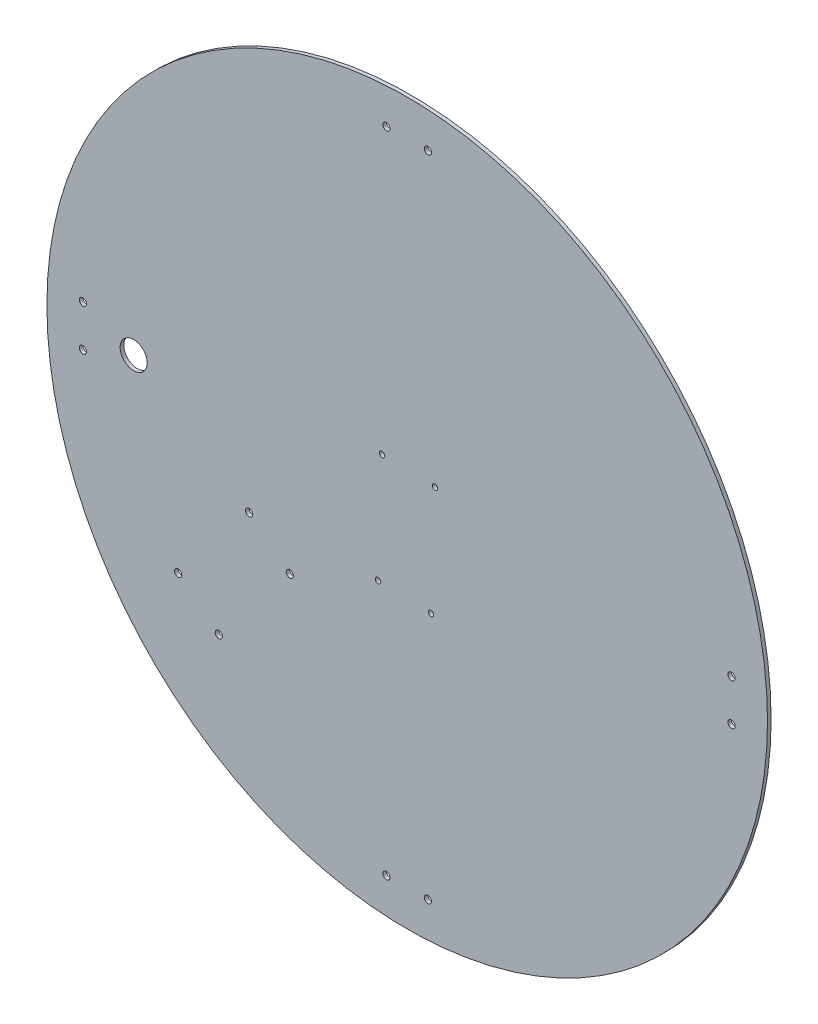
ISO-10303-21;
HEADER;
FILE_DESCRIPTION(('STEP AP214'),'2;1');
FILE_NAME('part.step','',(''),(''),'','','');
FILE_SCHEMA(('AUTOMOTIVE_DESIGN { 1 0 10303 214 1 1 1 1 }'));
ENDSEC;
DATA;
#1=APPLICATION_CONTEXT('core data for automotive mechanical design processes');
#2=APPLICATION_PROTOCOL_DEFINITION('international standard','automotive_design',2000,#1);
#3=PRODUCT_CONTEXT('',#1,'mechanical');
#4=PRODUCT('Part','Part','',(#3));
#5=PRODUCT_RELATED_PRODUCT_CATEGORY('part','',(#4));
#6=PRODUCT_DEFINITION_FORMATION('','',#4);
#7=PRODUCT_DEFINITION_CONTEXT('part definition',#1,'design');
#8=PRODUCT_DEFINITION('design','',#6,#7);
#9=PRODUCT_DEFINITION_SHAPE('','',#8);
#10=(LENGTH_UNIT() NAMED_UNIT(*) SI_UNIT(.MILLI.,.METRE.));
#11=(NAMED_UNIT(*) PLANE_ANGLE_UNIT() SI_UNIT($,.RADIAN.));
#12=(NAMED_UNIT(*) SI_UNIT($,.STERADIAN.) SOLID_ANGLE_UNIT());
#13=UNCERTAINTY_MEASURE_WITH_UNIT(LENGTH_MEASURE(1.E-05),#10,'distance_accuracy_value','');
#14=(GEOMETRIC_REPRESENTATION_CONTEXT(3) GLOBAL_UNCERTAINTY_ASSIGNED_CONTEXT((#13)) GLOBAL_UNIT_ASSIGNED_CONTEXT((#10,
#11,#12)) REPRESENTATION_CONTEXT('',''));
#15=CARTESIAN_POINT('',(0.,0.,0.));
#16=DIRECTION('',(0.,0.,1.));
#17=DIRECTION('',(1.,0.,0.));
#18=AXIS2_PLACEMENT_3D('',#15,#16,#17);
#19=CARTESIAN_POINT('',(0.,0.,2.));
#20=DIRECTION('',(0.,0.,-1.));
#21=DIRECTION('',(-1.,0.,0.));
#22=AXIS2_PLACEMENT_3D('',#19,#20,#21);
#23=CYLINDRICAL_SURFACE('',#22,200.);
#24=CARTESIAN_POINT('',(0.,0.,2.));
#25=DIRECTION('',(0.,0.,1.));
#26=DIRECTION('',(1.,0.,0.));
#27=AXIS2_PLACEMENT_3D('',#24,#25,#26);
#28=CIRCLE('',#27,200.);
#29=CARTESIAN_POINT('',(200.,0.,2.));
#30=VERTEX_POINT('',#29);
#31=EDGE_CURVE('E12',#30,#30,#28,.T.);
#32=ORIENTED_EDGE('',*,*,#31,.F.);
#33=EDGE_LOOP('',(#32));
#34=FACE_BOUND('',#33,.T.);
#35=CARTESIAN_POINT('',(0.,0.,0.));
#36=DIRECTION('',(0.,0.,1.));
#37=DIRECTION('',(1.,0.,0.));
#38=AXIS2_PLACEMENT_3D('',#35,#36,#37);
#39=CIRCLE('',#38,200.);
#40=CARTESIAN_POINT('',(200.,0.,0.));
#41=VERTEX_POINT('',#40);
#42=EDGE_CURVE('E47',#41,#41,#39,.T.);
#43=ORIENTED_EDGE('',*,*,#42,.T.);
#44=EDGE_LOOP('',(#43));
#45=FACE_BOUND('',#44,.T.);
#46=ADVANCED_FACE('F44',(#34,#45),#23,.T.);
#47=CARTESIAN_POINT('',(0.,0.,2.));
#48=DIRECTION('',(0.,0.,1.));
#49=DIRECTION('',(1.,0.,0.));
#50=AXIS2_PLACEMENT_3D('',#47,#48,#49);
#51=PLANE('',#50);
#52=CARTESIAN_POINT('',(-13.9482140909751,21.2138474509534,2.));
#53=DIRECTION('',(0.,0.,1.));
#54=DIRECTION('',(1.,0.,0.));
#55=AXIS2_PLACEMENT_3D('',#52,#53,#54);
#56=CIRCLE('',#55,1.50000000000003);
#57=CARTESIAN_POINT('',(-12.4482140909751,21.2138474509534,2.));
#58=VERTEX_POINT('',#57);
#59=EDGE_CURVE('E126',#58,#58,#56,.T.);
#60=ORIENTED_EDGE('',*,*,#59,.F.);
#61=EDGE_LOOP('',(#60));
#62=FACE_BOUND('',#61,.T.);
#63=CARTESIAN_POINT('',(13.2166420172915,-41.6007256401468,2.));
#64=DIRECTION('',(0.,0.,1.));
#65=DIRECTION('',(1.,0.,0.));
#66=AXIS2_PLACEMENT_3D('',#63,#64,#65);
#67=CIRCLE('',#66,1.50000000000003);
#68=CARTESIAN_POINT('',(14.7166420172915,-41.6007256401468,2.));
#69=VERTEX_POINT('',#68);
#70=EDGE_CURVE('E136',#69,#69,#67,.T.);
#71=ORIENTED_EDGE('',*,*,#70,.F.);
#72=EDGE_LOOP('',(#71));
#73=FACE_BOUND('',#72,.T.);
#74=CARTESIAN_POINT('',(-16.1644471377225,-40.5464011810145,2.));
#75=DIRECTION('',(0.,0.,1.));
#76=DIRECTION('',(1.,0.,0.));
#77=AXIS2_PLACEMENT_3D('',#74,#75,#76);
#78=CIRCLE('',#77,1.50000000000003);
#79=CARTESIAN_POINT('',(-14.6644471377224,-40.5464011810145,2.));
#80=VERTEX_POINT('',#79);
#81=EDGE_CURVE('E139',#80,#80,#78,.T.);
#82=ORIENTED_EDGE('',*,*,#81,.F.);
#83=EDGE_LOOP('',(#82));
#84=FACE_BOUND('',#83,.T.);
#85=CARTESIAN_POINT('',(15.4328750640389,20.1595229918212,2.));
#86=DIRECTION('',(0.,0.,1.));
#87=DIRECTION('',(1.,0.,0.));
#88=AXIS2_PLACEMENT_3D('',#85,#86,#87);
#89=CIRCLE('',#88,1.50000000000002);
#90=CARTESIAN_POINT('',(16.9328750640389,20.1595229918212,2.));
#91=VERTEX_POINT('',#90);
#92=EDGE_CURVE('E142',#91,#91,#89,.T.);
#93=ORIENTED_EDGE('',*,*,#92,.F.);
#94=EDGE_LOOP('',(#93));
#95=FACE_BOUND('',#94,.T.);
#96=CARTESIAN_POINT('',(-127.130690153828,-92.4128741981416,2.));
#97=DIRECTION('',(0.,0.,1.));
#98=DIRECTION('',(1.,0.,0.));
#99=AXIS2_PLACEMENT_3D('',#96,#97,#98);
#100=CIRCLE('',#99,2.);
#101=CARTESIAN_POINT('',(-125.130690153828,-92.4128741981416,2.));
#102=VERTEX_POINT('',#101);
#103=EDGE_CURVE('E107',#102,#102,#100,.T.);
#104=ORIENTED_EDGE('',*,*,#103,.F.);
#105=EDGE_LOOP('',(#104));
#106=FACE_BOUND('',#105,.T.);
#107=CARTESIAN_POINT('',(-104.565936539044,-110.629127773014,2.));
#108=DIRECTION('',(0.,0.,1.));
#109=DIRECTION('',(1.,0.,0.));
#110=AXIS2_PLACEMENT_3D('',#107,#108,#109);
#111=CIRCLE('',#110,2.);
#112=CARTESIAN_POINT('',(-102.565936539044,-110.629127773014,2.));
#113=VERTEX_POINT('',#112);
#114=EDGE_CURVE('E112',#113,#113,#111,.T.);
#115=ORIENTED_EDGE('',*,*,#114,.F.);
#116=EDGE_LOOP('',(#115));
#117=FACE_BOUND('',#116,.T.);
#118=CARTESIAN_POINT('',(-65.1811400168184,-61.8425742679459,2.));
#119=DIRECTION('',(0.,0.,1.));
#120=DIRECTION('',(1.,0.,0.));
#121=AXIS2_PLACEMENT_3D('',#118,#119,#120);
#122=CIRCLE('',#121,2.);
#123=CARTESIAN_POINT('',(-63.1811400168184,-61.8425742679459,2.));
#124=VERTEX_POINT('',#123);
#125=EDGE_CURVE('E115',#124,#124,#122,.T.);
#126=ORIENTED_EDGE('',*,*,#125,.F.);
#127=EDGE_LOOP('',(#126));
#128=FACE_BOUND('',#127,.T.);
#129=CARTESIAN_POINT('',(-87.7458936316029,-43.626320693073,2.));
#130=DIRECTION('',(0.,0.,1.));
#131=DIRECTION('',(1.,0.,0.));
#132=AXIS2_PLACEMENT_3D('',#129,#130,#131);
#133=CIRCLE('',#132,2.);
#134=CARTESIAN_POINT('',(-85.7458936316029,-43.626320693073,2.));
#135=VERTEX_POINT('',#134);
#136=EDGE_CURVE('E118',#135,#135,#133,.T.);
#137=ORIENTED_EDGE('',*,*,#136,.F.);
#138=EDGE_LOOP('',(#137));
#139=FACE_BOUND('',#138,.T.);
#140=CARTESIAN_POINT('',(-151.829580254539,0.,2.));
#141=DIRECTION('',(0.,0.,-1.));
#142=DIRECTION('',(-1.,0.,0.));
#143=AXIS2_PLACEMENT_3D('',#140,#141,#142);
#144=CIRCLE('',#143,7.50000000000001);
#145=CARTESIAN_POINT('',(-159.329580254539,0.,2.));
#146=VERTEX_POINT('',#145);
#147=EDGE_CURVE('E103',#146,#146,#144,.T.);
#148=ORIENTED_EDGE('',*,*,#147,.T.);
#149=EDGE_LOOP('',(#148));
#150=FACE_BOUND('',#149,.T.);
#151=CARTESIAN_POINT('',(180.,11.5000000000019,2.));
#152=DIRECTION('',(0.,0.,1.));
#153=DIRECTION('',(1.,0.,0.));
#154=AXIS2_PLACEMENT_3D('',#151,#152,#153);
#155=CIRCLE('',#154,2.);
#156=CARTESIAN_POINT('',(182.,11.5000000000019,2.));
#157=VERTEX_POINT('',#156);
#158=EDGE_CURVE('E65',#157,#157,#155,.T.);
#159=ORIENTED_EDGE('',*,*,#158,.F.);
#160=EDGE_LOOP('',(#159));
#161=FACE_BOUND('',#160,.T.);
#162=CARTESIAN_POINT('',(-11.5,-180.,2.));
#163=DIRECTION('',(0.,0.,1.));
#164=DIRECTION('',(1.,0.,0.));
#165=AXIS2_PLACEMENT_3D('',#162,#163,#164);
#166=CIRCLE('',#165,2.);
#167=CARTESIAN_POINT('',(-9.5,-180.,2.));
#168=VERTEX_POINT('',#167);
#169=EDGE_CURVE('E70',#168,#168,#166,.T.);
#170=ORIENTED_EDGE('',*,*,#169,.F.);
#171=EDGE_LOOP('',(#170));
#172=FACE_BOUND('',#171,.T.);
#173=CARTESIAN_POINT('',(11.5,-180.,2.));
#174=DIRECTION('',(0.,0.,1.));
#175=DIRECTION('',(1.,0.,0.));
#176=AXIS2_PLACEMENT_3D('',#173,#174,#175);
#177=CIRCLE('',#176,2.);
#178=CARTESIAN_POINT('',(13.5,-180.,2.));
#179=VERTEX_POINT('',#178);
#180=EDGE_CURVE('E73',#179,#179,#177,.T.);
#181=ORIENTED_EDGE('',*,*,#180,.F.);
#182=EDGE_LOOP('',(#181));
#183=FACE_BOUND('',#182,.T.);
#184=CARTESIAN_POINT('',(-180.,11.4999999999994,2.));
#185=DIRECTION('',(0.,0.,1.));
#186=DIRECTION('',(1.,0.,0.));
#187=AXIS2_PLACEMENT_3D('',#184,#185,#186);
#188=CIRCLE('',#187,2.);
#189=CARTESIAN_POINT('',(-178.,11.4999999999994,2.));
#190=VERTEX_POINT('',#189);
#191=EDGE_CURVE('E76',#190,#190,#188,.T.);
#192=ORIENTED_EDGE('',*,*,#191,.F.);
#193=EDGE_LOOP('',(#192));
#194=FACE_BOUND('',#193,.T.);
#195=CARTESIAN_POINT('',(180.,-11.4999999999981,2.));
#196=DIRECTION('',(0.,0.,1.));
#197=DIRECTION('',(1.,0.,0.));
#198=AXIS2_PLACEMENT_3D('',#195,#196,#197);
#199=CIRCLE('',#198,2.);
#200=CARTESIAN_POINT('',(182.,-11.4999999999981,2.));
#201=VERTEX_POINT('',#200);
#202=EDGE_CURVE('E79',#201,#201,#199,.T.);
#203=ORIENTED_EDGE('',*,*,#202,.F.);
#204=EDGE_LOOP('',(#203));
#205=FACE_BOUND('',#204,.T.);
#206=CARTESIAN_POINT('',(-180.,-11.5000000000006,2.));
#207=DIRECTION('',(0.,0.,1.));
#208=DIRECTION('',(1.,0.,0.));
#209=AXIS2_PLACEMENT_3D('',#206,#207,#208);
#210=CIRCLE('',#209,2.);
#211=CARTESIAN_POINT('',(-178.,-11.5000000000006,2.));
#212=VERTEX_POINT('',#211);
#213=EDGE_CURVE('E82',#212,#212,#210,.T.);
#214=ORIENTED_EDGE('',*,*,#213,.F.);
#215=EDGE_LOOP('',(#214));
#216=FACE_BOUND('',#215,.T.);
#217=CARTESIAN_POINT('',(-11.5,180.,2.));
#218=DIRECTION('',(0.,0.,1.));
#219=DIRECTION('',(1.,0.,0.));
#220=AXIS2_PLACEMENT_3D('',#217,#218,#219);
#221=CIRCLE('',#220,2.);
#222=CARTESIAN_POINT('',(-9.5,180.,2.));
#223=VERTEX_POINT('',#222);
#224=EDGE_CURVE('E54',#223,#223,#221,.T.);
#225=ORIENTED_EDGE('',*,*,#224,.F.);
#226=EDGE_LOOP('',(#225));
#227=FACE_BOUND('',#226,.T.);
#228=CARTESIAN_POINT('',(11.5,180.,2.));
#229=DIRECTION('',(0.,0.,1.));
#230=DIRECTION('',(1.,0.,0.));
#231=AXIS2_PLACEMENT_3D('',#228,#229,#230);
#232=CIRCLE('',#231,2.);
#233=CARTESIAN_POINT('',(13.5,180.,2.));
#234=VERTEX_POINT('',#233);
#235=EDGE_CURVE('E58',#234,#234,#232,.T.);
#236=ORIENTED_EDGE('',*,*,#235,.F.);
#237=EDGE_LOOP('',(#236));
#238=FACE_BOUND('',#237,.T.);
#239=ORIENTED_EDGE('',*,*,#31,.T.);
#240=EDGE_LOOP('',(#239));
#241=FACE_BOUND('',#240,.T.);
#242=ADVANCED_FACE('F164',(#62,#73,#84,#95,#106,#117,#128,#139,#150,#161,#172,#183,#194,#205,
#216,#227,#238,#241),#51,.T.);
#243=CARTESIAN_POINT('',(0.,0.,0.));
#244=DIRECTION('',(0.,0.,1.));
#245=DIRECTION('',(1.,0.,0.));
#246=AXIS2_PLACEMENT_3D('',#243,#244,#245);
#247=PLANE('',#246);
#248=CARTESIAN_POINT('',(-13.9482140909751,21.2138474509534,0.));
#249=DIRECTION('',(0.,0.,-1.));
#250=DIRECTION('',(-1.,0.,0.));
#251=AXIS2_PLACEMENT_3D('',#248,#249,#250);
#252=CIRCLE('',#251,1.50000000000003);
#253=CARTESIAN_POINT('',(-15.4482140909751,21.2138474509534,0.));
#254=VERTEX_POINT('',#253);
#255=EDGE_CURVE('E148',#254,#254,#252,.T.);
#256=ORIENTED_EDGE('',*,*,#255,.F.);
#257=EDGE_LOOP('',(#256));
#258=FACE_BOUND('',#257,.T.);
#259=CARTESIAN_POINT('',(13.2166420172915,-41.6007256401468,0.));
#260=DIRECTION('',(0.,0.,-1.));
#261=DIRECTION('',(-1.,0.,0.));
#262=AXIS2_PLACEMENT_3D('',#259,#260,#261);
#263=CIRCLE('',#262,1.50000000000003);
#264=CARTESIAN_POINT('',(11.7166420172915,-41.6007256401468,0.));
#265=VERTEX_POINT('',#264);
#266=EDGE_CURVE('E149',#265,#265,#263,.T.);
#267=ORIENTED_EDGE('',*,*,#266,.F.);
#268=EDGE_LOOP('',(#267));
#269=FACE_BOUND('',#268,.T.);
#270=CARTESIAN_POINT('',(-16.1644471377225,-40.5464011810145,0.));
#271=DIRECTION('',(0.,0.,-1.));
#272=DIRECTION('',(-1.,0.,0.));
#273=AXIS2_PLACEMENT_3D('',#270,#271,#272);
#274=CIRCLE('',#273,1.50000000000003);
#275=CARTESIAN_POINT('',(-17.6644471377225,-40.5464011810145,0.));
#276=VERTEX_POINT('',#275);
#277=EDGE_CURVE('E152',#276,#276,#274,.T.);
#278=ORIENTED_EDGE('',*,*,#277,.F.);
#279=EDGE_LOOP('',(#278));
#280=FACE_BOUND('',#279,.T.);
#281=CARTESIAN_POINT('',(15.4328750640389,20.1595229918212,0.));
#282=DIRECTION('',(0.,0.,-1.));
#283=DIRECTION('',(-1.,0.,0.));
#284=AXIS2_PLACEMENT_3D('',#281,#282,#283);
#285=CIRCLE('',#284,1.50000000000002);
#286=CARTESIAN_POINT('',(13.9328750640388,20.1595229918212,0.));
#287=VERTEX_POINT('',#286);
#288=EDGE_CURVE('E145',#287,#287,#285,.T.);
#289=ORIENTED_EDGE('',*,*,#288,.F.);
#290=EDGE_LOOP('',(#289));
#291=FACE_BOUND('',#290,.T.);
#292=CARTESIAN_POINT('',(-127.130690153828,-92.4128741981416,0.));
#293=DIRECTION('',(0.,0.,-1.));
#294=DIRECTION('',(-1.,0.,0.));
#295=AXIS2_PLACEMENT_3D('',#292,#293,#294);
#296=CIRCLE('',#295,2.);
#297=CARTESIAN_POINT('',(-129.130690153828,-92.4128741981416,0.));
#298=VERTEX_POINT('',#297);
#299=EDGE_CURVE('E121',#298,#298,#296,.T.);
#300=ORIENTED_EDGE('',*,*,#299,.F.);
#301=EDGE_LOOP('',(#300));
#302=FACE_BOUND('',#301,.T.);
#303=CARTESIAN_POINT('',(-104.565936539044,-110.629127773014,0.));
#304=DIRECTION('',(0.,0.,-1.));
#305=DIRECTION('',(-1.,0.,0.));
#306=AXIS2_PLACEMENT_3D('',#303,#304,#305);
#307=CIRCLE('',#306,2.);
#308=CARTESIAN_POINT('',(-106.565936539044,-110.629127773014,0.));
#309=VERTEX_POINT('',#308);
#310=EDGE_CURVE('E129',#309,#309,#307,.T.);
#311=ORIENTED_EDGE('',*,*,#310,.F.);
#312=EDGE_LOOP('',(#311));
#313=FACE_BOUND('',#312,.T.);
#314=CARTESIAN_POINT('',(-65.1811400168184,-61.8425742679459,0.));
#315=DIRECTION('',(0.,0.,-1.));
#316=DIRECTION('',(-1.,0.,0.));
#317=AXIS2_PLACEMENT_3D('',#314,#315,#316);
#318=CIRCLE('',#317,2.);
#319=CARTESIAN_POINT('',(-67.1811400168184,-61.8425742679459,0.));
#320=VERTEX_POINT('',#319);
#321=EDGE_CURVE('E125',#320,#320,#318,.T.);
#322=ORIENTED_EDGE('',*,*,#321,.F.);
#323=EDGE_LOOP('',(#322));
#324=FACE_BOUND('',#323,.T.);
#325=CARTESIAN_POINT('',(-87.7458936316029,-43.626320693073,0.));
#326=DIRECTION('',(0.,0.,-1.));
#327=DIRECTION('',(-1.,0.,0.));
#328=AXIS2_PLACEMENT_3D('',#325,#326,#327);
#329=CIRCLE('',#328,2.);
#330=CARTESIAN_POINT('',(-89.7458936316029,-43.626320693073,0.));
#331=VERTEX_POINT('',#330);
#332=EDGE_CURVE('E122',#331,#331,#329,.T.);
#333=ORIENTED_EDGE('',*,*,#332,.F.);
#334=EDGE_LOOP('',(#333));
#335=FACE_BOUND('',#334,.T.);
#336=CARTESIAN_POINT('',(-151.829580254539,0.,0.));
#337=DIRECTION('',(0.,0.,-1.));
#338=DIRECTION('',(-1.,0.,0.));
#339=AXIS2_PLACEMENT_3D('',#336,#337,#338);
#340=CIRCLE('',#339,7.50000000000001);
#341=CARTESIAN_POINT('',(-159.329580254539,0.,0.));
#342=VERTEX_POINT('',#341);
#343=EDGE_CURVE('E104',#342,#342,#340,.T.);
#344=ORIENTED_EDGE('',*,*,#343,.F.);
#345=EDGE_LOOP('',(#344));
#346=FACE_BOUND('',#345,.T.);
#347=CARTESIAN_POINT('',(180.,11.5000000000019,0.));
#348=DIRECTION('',(0.,0.,-1.));
#349=DIRECTION('',(0.,1.,0.));
#350=AXIS2_PLACEMENT_3D('',#347,#348,#349);
#351=CIRCLE('',#350,2.);
#352=CARTESIAN_POINT('',(180.,13.5000000000019,0.));
#353=VERTEX_POINT('',#352);
#354=EDGE_CURVE('E95',#353,#353,#351,.T.);
#355=ORIENTED_EDGE('',*,*,#354,.F.);
#356=EDGE_LOOP('',(#355));
#357=FACE_BOUND('',#356,.T.);
#358=CARTESIAN_POINT('',(-11.5,-180.,0.));
#359=DIRECTION('',(0.,0.,-1.));
#360=DIRECTION('',(-1.,0.,0.));
#361=AXIS2_PLACEMENT_3D('',#358,#359,#360);
#362=CIRCLE('',#361,2.);
#363=CARTESIAN_POINT('',(-13.5,-180.,0.));
#364=VERTEX_POINT('',#363);
#365=EDGE_CURVE('E92',#364,#364,#362,.T.);
#366=ORIENTED_EDGE('',*,*,#365,.F.);
#367=EDGE_LOOP('',(#366));
#368=FACE_BOUND('',#367,.T.);
#369=CARTESIAN_POINT('',(11.5,-180.,0.));
#370=DIRECTION('',(0.,0.,-1.));
#371=DIRECTION('',(1.,0.,0.));
#372=AXIS2_PLACEMENT_3D('',#369,#370,#371);
#373=CIRCLE('',#372,2.);
#374=CARTESIAN_POINT('',(13.5,-180.,0.));
#375=VERTEX_POINT('',#374);
#376=EDGE_CURVE('E89',#375,#375,#373,.T.);
#377=ORIENTED_EDGE('',*,*,#376,.F.);
#378=EDGE_LOOP('',(#377));
#379=FACE_BOUND('',#378,.T.);
#380=CARTESIAN_POINT('',(-180.,11.4999999999994,0.));
#381=DIRECTION('',(0.,0.,-1.));
#382=DIRECTION('',(0.,1.,0.));
#383=AXIS2_PLACEMENT_3D('',#380,#381,#382);
#384=CIRCLE('',#383,2.);
#385=CARTESIAN_POINT('',(-180.,13.4999999999994,0.));
#386=VERTEX_POINT('',#385);
#387=EDGE_CURVE('E88',#386,#386,#384,.T.);
#388=ORIENTED_EDGE('',*,*,#387,.F.);
#389=EDGE_LOOP('',(#388));
#390=FACE_BOUND('',#389,.T.);
#391=CARTESIAN_POINT('',(180.,-11.4999999999981,0.));
#392=DIRECTION('',(0.,0.,-1.));
#393=DIRECTION('',(0.,-1.,0.));
#394=AXIS2_PLACEMENT_3D('',#391,#392,#393);
#395=CIRCLE('',#394,2.);
#396=CARTESIAN_POINT('',(180.,-13.4999999999981,0.));
#397=VERTEX_POINT('',#396);
#398=EDGE_CURVE('E98',#397,#397,#395,.T.);
#399=ORIENTED_EDGE('',*,*,#398,.F.);
#400=EDGE_LOOP('',(#399));
#401=FACE_BOUND('',#400,.T.);
#402=CARTESIAN_POINT('',(-180.,-11.5000000000006,0.));
#403=DIRECTION('',(0.,0.,-1.));
#404=DIRECTION('',(0.,-1.,0.));
#405=AXIS2_PLACEMENT_3D('',#402,#403,#404);
#406=CIRCLE('',#405,2.);
#407=CARTESIAN_POINT('',(-180.,-13.5000000000006,0.));
#408=VERTEX_POINT('',#407);
#409=EDGE_CURVE('E85',#408,#408,#406,.T.);
#410=ORIENTED_EDGE('',*,*,#409,.F.);
#411=EDGE_LOOP('',(#410));
#412=FACE_BOUND('',#411,.T.);
#413=CARTESIAN_POINT('',(-11.5,180.,0.));
#414=DIRECTION('',(0.,0.,-1.));
#415=DIRECTION('',(-1.,0.,0.));
#416=AXIS2_PLACEMENT_3D('',#413,#414,#415);
#417=CIRCLE('',#416,2.);
#418=CARTESIAN_POINT('',(-13.5,180.,0.));
#419=VERTEX_POINT('',#418);
#420=EDGE_CURVE('E61',#419,#419,#417,.T.);
#421=ORIENTED_EDGE('',*,*,#420,.F.);
#422=EDGE_LOOP('',(#421));
#423=FACE_BOUND('',#422,.T.);
#424=CARTESIAN_POINT('',(11.5,180.,0.));
#425=DIRECTION('',(0.,0.,-1.));
#426=DIRECTION('',(1.,0.,0.));
#427=AXIS2_PLACEMENT_3D('',#424,#425,#426);
#428=CIRCLE('',#427,2.);
#429=CARTESIAN_POINT('',(13.5,180.,0.));
#430=VERTEX_POINT('',#429);
#431=EDGE_CURVE('E62',#430,#430,#428,.T.);
#432=ORIENTED_EDGE('',*,*,#431,.F.);
#433=EDGE_LOOP('',(#432));
#434=FACE_BOUND('',#433,.T.);
#435=ORIENTED_EDGE('',*,*,#42,.F.);
#436=EDGE_LOOP('',(#435));
#437=FACE_BOUND('',#436,.T.);
#438=ADVANCED_FACE('F160',(#258,#269,#280,#291,#302,#313,#324,#335,#346,#357,#368,#379,#390,
#401,#412,#423,#434,#437),#247,.F.);
#439=CARTESIAN_POINT('',(11.5,180.,13.));
#440=DIRECTION('',(0.,0.,-1.));
#441=DIRECTION('',(-1.,0.,0.));
#442=AXIS2_PLACEMENT_3D('',#439,#440,#441);
#443=CYLINDRICAL_SURFACE('',#442,2.);
#444=ORIENTED_EDGE('',*,*,#235,.T.);
#445=EDGE_LOOP('',(#444));
#446=FACE_BOUND('',#445,.T.);
#447=ORIENTED_EDGE('',*,*,#431,.T.);
#448=EDGE_LOOP('',(#447));
#449=FACE_BOUND('',#448,.T.);
#450=ADVANCED_FACE('F163',(#446,#449),#443,.F.);
#451=CARTESIAN_POINT('',(-11.5,180.,13.));
#452=DIRECTION('',(0.,0.,-1.));
#453=DIRECTION('',(-1.,0.,0.));
#454=AXIS2_PLACEMENT_3D('',#451,#452,#453);
#455=CYLINDRICAL_SURFACE('',#454,2.);
#456=ORIENTED_EDGE('',*,*,#224,.T.);
#457=EDGE_LOOP('',(#456));
#458=FACE_BOUND('',#457,.T.);
#459=ORIENTED_EDGE('',*,*,#420,.T.);
#460=EDGE_LOOP('',(#459));
#461=FACE_BOUND('',#460,.T.);
#462=ADVANCED_FACE('F211',(#458,#461),#455,.F.);
#463=CARTESIAN_POINT('',(-180.,-11.5000000000006,13.));
#464=DIRECTION('',(0.,0.,-1.));
#465=DIRECTION('',(-1.,0.,0.));
#466=AXIS2_PLACEMENT_3D('',#463,#464,#465);
#467=CYLINDRICAL_SURFACE('',#466,2.);
#468=ORIENTED_EDGE('',*,*,#213,.T.);
#469=EDGE_LOOP('',(#468));
#470=FACE_BOUND('',#469,.T.);
#471=ORIENTED_EDGE('',*,*,#409,.T.);
#472=EDGE_LOOP('',(#471));
#473=FACE_BOUND('',#472,.T.);
#474=ADVANCED_FACE('F215',(#470,#473),#467,.F.);
#475=CARTESIAN_POINT('',(180.,-11.4999999999981,13.));
#476=DIRECTION('',(0.,0.,-1.));
#477=DIRECTION('',(-1.,0.,0.));
#478=AXIS2_PLACEMENT_3D('',#475,#476,#477);
#479=CYLINDRICAL_SURFACE('',#478,2.);
#480=ORIENTED_EDGE('',*,*,#202,.T.);
#481=EDGE_LOOP('',(#480));
#482=FACE_BOUND('',#481,.T.);
#483=ORIENTED_EDGE('',*,*,#398,.T.);
#484=EDGE_LOOP('',(#483));
#485=FACE_BOUND('',#484,.T.);
#486=ADVANCED_FACE('F219',(#482,#485),#479,.F.);
#487=CARTESIAN_POINT('',(-180.,11.4999999999994,13.));
#488=DIRECTION('',(0.,0.,-1.));
#489=DIRECTION('',(-1.,0.,0.));
#490=AXIS2_PLACEMENT_3D('',#487,#488,#489);
#491=CYLINDRICAL_SURFACE('',#490,2.);
#492=ORIENTED_EDGE('',*,*,#191,.T.);
#493=EDGE_LOOP('',(#492));
#494=FACE_BOUND('',#493,.T.);
#495=ORIENTED_EDGE('',*,*,#387,.T.);
#496=EDGE_LOOP('',(#495));
#497=FACE_BOUND('',#496,.T.);
#498=ADVANCED_FACE('F225',(#494,#497),#491,.F.);
#499=CARTESIAN_POINT('',(11.5,-180.,13.));
#500=DIRECTION('',(0.,0.,-1.));
#501=DIRECTION('',(-1.,0.,0.));
#502=AXIS2_PLACEMENT_3D('',#499,#500,#501);
#503=CYLINDRICAL_SURFACE('',#502,2.);
#504=ORIENTED_EDGE('',*,*,#180,.T.);
#505=EDGE_LOOP('',(#504));
#506=FACE_BOUND('',#505,.T.);
#507=ORIENTED_EDGE('',*,*,#376,.T.);
#508=EDGE_LOOP('',(#507));
#509=FACE_BOUND('',#508,.T.);
#510=ADVANCED_FACE('F221',(#506,#509),#503,.F.);
#511=CARTESIAN_POINT('',(-11.5,-180.,13.));
#512=DIRECTION('',(0.,0.,-1.));
#513=DIRECTION('',(-1.,0.,0.));
#514=AXIS2_PLACEMENT_3D('',#511,#512,#513);
#515=CYLINDRICAL_SURFACE('',#514,2.);
#516=ORIENTED_EDGE('',*,*,#169,.T.);
#517=EDGE_LOOP('',(#516));
#518=FACE_BOUND('',#517,.T.);
#519=ORIENTED_EDGE('',*,*,#365,.T.);
#520=EDGE_LOOP('',(#519));
#521=FACE_BOUND('',#520,.T.);
#522=ADVANCED_FACE('F224',(#518,#521),#515,.F.);
#523=CARTESIAN_POINT('',(180.,11.5000000000019,13.));
#524=DIRECTION('',(0.,0.,-1.));
#525=DIRECTION('',(-1.,0.,0.));
#526=AXIS2_PLACEMENT_3D('',#523,#524,#525);
#527=CYLINDRICAL_SURFACE('',#526,2.);
#528=ORIENTED_EDGE('',*,*,#158,.T.);
#529=EDGE_LOOP('',(#528));
#530=FACE_BOUND('',#529,.T.);
#531=ORIENTED_EDGE('',*,*,#354,.T.);
#532=EDGE_LOOP('',(#531));
#533=FACE_BOUND('',#532,.T.);
#534=ADVANCED_FACE('F230',(#530,#533),#527,.F.);
#535=CARTESIAN_POINT('',(-151.829580254539,0.,2.));
#536=DIRECTION('',(0.,0.,-1.));
#537=DIRECTION('',(-1.,0.,0.));
#538=AXIS2_PLACEMENT_3D('',#535,#536,#537);
#539=CYLINDRICAL_SURFACE('',#538,7.50000000000001);
#540=ORIENTED_EDGE('',*,*,#147,.F.);
#541=EDGE_LOOP('',(#540));
#542=FACE_BOUND('',#541,.T.);
#543=ORIENTED_EDGE('',*,*,#343,.T.);
#544=EDGE_LOOP('',(#543));
#545=FACE_BOUND('',#544,.T.);
#546=ADVANCED_FACE('F233',(#542,#545),#539,.F.);
#547=CARTESIAN_POINT('',(-87.7458936316029,-43.626320693073,10.));
#548=DIRECTION('',(0.,0.,-1.));
#549=DIRECTION('',(-1.,0.,0.));
#550=AXIS2_PLACEMENT_3D('',#547,#548,#549);
#551=CYLINDRICAL_SURFACE('',#550,2.);
#552=ORIENTED_EDGE('',*,*,#136,.T.);
#553=EDGE_LOOP('',(#552));
#554=FACE_BOUND('',#553,.T.);
#555=ORIENTED_EDGE('',*,*,#332,.T.);
#556=EDGE_LOOP('',(#555));
#557=FACE_BOUND('',#556,.T.);
#558=ADVANCED_FACE('F243',(#554,#557),#551,.F.);
#559=CARTESIAN_POINT('',(-65.1811400168184,-61.8425742679459,10.));
#560=DIRECTION('',(0.,0.,-1.));
#561=DIRECTION('',(-1.,0.,0.));
#562=AXIS2_PLACEMENT_3D('',#559,#560,#561);
#563=CYLINDRICAL_SURFACE('',#562,2.);
#564=ORIENTED_EDGE('',*,*,#125,.T.);
#565=EDGE_LOOP('',(#564));
#566=FACE_BOUND('',#565,.T.);
#567=ORIENTED_EDGE('',*,*,#321,.T.);
#568=EDGE_LOOP('',(#567));
#569=FACE_BOUND('',#568,.T.);
#570=ADVANCED_FACE('F247',(#566,#569),#563,.F.);
#571=CARTESIAN_POINT('',(-104.565936539044,-110.629127773014,10.));
#572=DIRECTION('',(0.,0.,-1.));
#573=DIRECTION('',(-1.,0.,0.));
#574=AXIS2_PLACEMENT_3D('',#571,#572,#573);
#575=CYLINDRICAL_SURFACE('',#574,2.);
#576=ORIENTED_EDGE('',*,*,#114,.T.);
#577=EDGE_LOOP('',(#576));
#578=FACE_BOUND('',#577,.T.);
#579=ORIENTED_EDGE('',*,*,#310,.T.);
#580=EDGE_LOOP('',(#579));
#581=FACE_BOUND('',#580,.T.);
#582=ADVANCED_FACE('F251',(#578,#581),#575,.F.);
#583=CARTESIAN_POINT('',(-127.130690153828,-92.4128741981416,10.));
#584=DIRECTION('',(0.,0.,-1.));
#585=DIRECTION('',(-1.,0.,0.));
#586=AXIS2_PLACEMENT_3D('',#583,#584,#585);
#587=CYLINDRICAL_SURFACE('',#586,2.);
#588=ORIENTED_EDGE('',*,*,#103,.T.);
#589=EDGE_LOOP('',(#588));
#590=FACE_BOUND('',#589,.T.);
#591=ORIENTED_EDGE('',*,*,#299,.T.);
#592=EDGE_LOOP('',(#591));
#593=FACE_BOUND('',#592,.T.);
#594=ADVANCED_FACE('F255',(#590,#593),#587,.F.);
#595=CARTESIAN_POINT('',(15.4328750640389,20.1595229918212,10.));
#596=DIRECTION('',(0.,0.,-1.));
#597=DIRECTION('',(-1.,0.,0.));
#598=AXIS2_PLACEMENT_3D('',#595,#596,#597);
#599=CYLINDRICAL_SURFACE('',#598,1.50000000000002);
#600=ORIENTED_EDGE('',*,*,#92,.T.);
#601=EDGE_LOOP('',(#600));
#602=FACE_BOUND('',#601,.T.);
#603=ORIENTED_EDGE('',*,*,#288,.T.);
#604=EDGE_LOOP('',(#603));
#605=FACE_BOUND('',#604,.T.);
#606=ADVANCED_FACE('F259',(#602,#605),#599,.F.);
#607=CARTESIAN_POINT('',(-16.1644471377225,-40.5464011810145,10.));
#608=DIRECTION('',(0.,0.,-1.));
#609=DIRECTION('',(-1.,0.,0.));
#610=AXIS2_PLACEMENT_3D('',#607,#608,#609);
#611=CYLINDRICAL_SURFACE('',#610,1.50000000000003);
#612=ORIENTED_EDGE('',*,*,#81,.T.);
#613=EDGE_LOOP('',(#612));
#614=FACE_BOUND('',#613,.T.);
#615=ORIENTED_EDGE('',*,*,#277,.T.);
#616=EDGE_LOOP('',(#615));
#617=FACE_BOUND('',#616,.T.);
#618=ADVANCED_FACE('F158',(#614,#617),#611,.F.);
#619=CARTESIAN_POINT('',(13.2166420172915,-41.6007256401468,10.));
#620=DIRECTION('',(0.,0.,-1.));
#621=DIRECTION('',(-1.,0.,0.));
#622=AXIS2_PLACEMENT_3D('',#619,#620,#621);
#623=CYLINDRICAL_SURFACE('',#622,1.50000000000003);
#624=ORIENTED_EDGE('',*,*,#70,.T.);
#625=EDGE_LOOP('',(#624));
#626=FACE_BOUND('',#625,.T.);
#627=ORIENTED_EDGE('',*,*,#266,.T.);
#628=EDGE_LOOP('',(#627));
#629=FACE_BOUND('',#628,.T.);
#630=ADVANCED_FACE('F264',(#626,#629),#623,.F.);
#631=CARTESIAN_POINT('',(-13.9482140909751,21.2138474509534,10.));
#632=DIRECTION('',(0.,0.,-1.));
#633=DIRECTION('',(-1.,0.,0.));
#634=AXIS2_PLACEMENT_3D('',#631,#632,#633);
#635=CYLINDRICAL_SURFACE('',#634,1.50000000000003);
#636=ORIENTED_EDGE('',*,*,#59,.T.);
#637=EDGE_LOOP('',(#636));
#638=FACE_BOUND('',#637,.T.);
#639=ORIENTED_EDGE('',*,*,#255,.T.);
#640=EDGE_LOOP('',(#639));
#641=FACE_BOUND('',#640,.T.);
#642=ADVANCED_FACE('F267',(#638,#641),#635,.F.);
#643=CLOSED_SHELL('',(#46,#242,#438,#450,#462,#474,#486,#498,#510,#522,#534,#546,#558,#570,#582,
#594,#606,#618,#630,#642));
#644=MANIFOLD_SOLID_BREP('B2',#643);
#645=ADVANCED_BREP_SHAPE_REPRESENTATION('',(#18,#644),#14);
#646=SHAPE_DEFINITION_REPRESENTATION(#9,#645);
ENDSEC;
END-ISO-10303-21;
